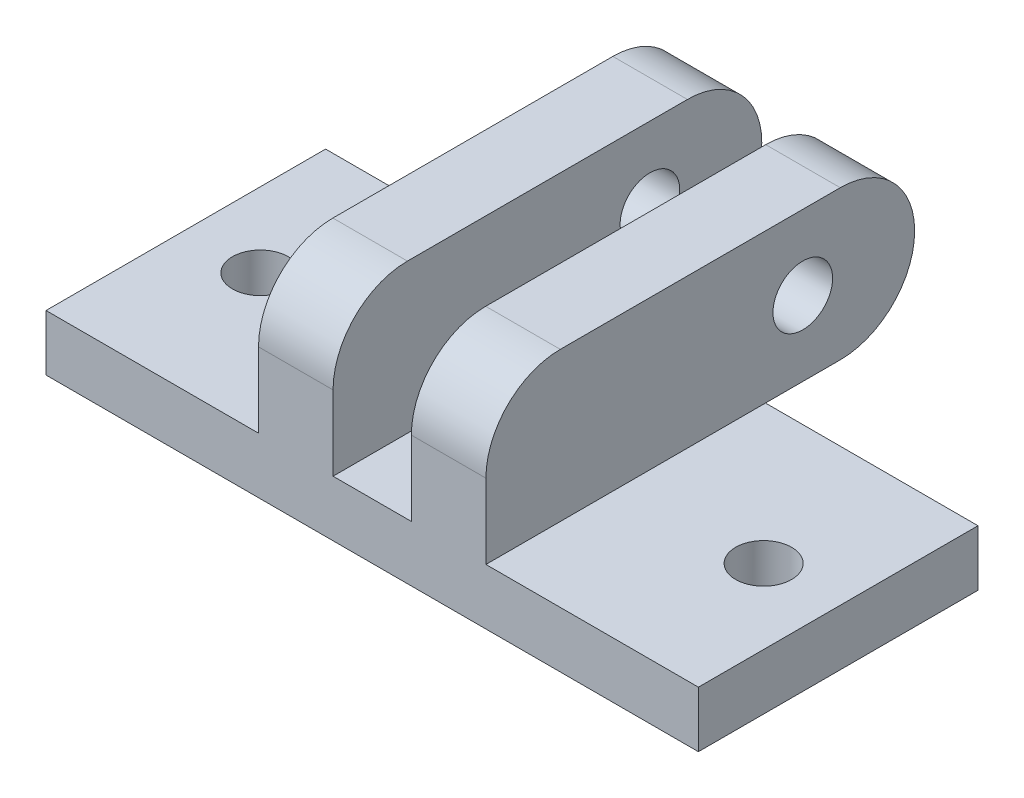
ISO-10303-21;
HEADER;
FILE_DESCRIPTION(('STEP AP214'),'2;1');
FILE_NAME('part.step','',(''),(''),'','','');
FILE_SCHEMA(('AUTOMOTIVE_DESIGN { 1 0 10303 214 1 1 1 1 }'));
ENDSEC;
DATA;
#1=APPLICATION_CONTEXT('core data for automotive mechanical design processes');
#2=APPLICATION_PROTOCOL_DEFINITION('international standard','automotive_design',2000,#1);
#3=PRODUCT_CONTEXT('',#1,'mechanical');
#4=PRODUCT('Part','Part','',(#3));
#5=PRODUCT_RELATED_PRODUCT_CATEGORY('part','',(#4));
#6=PRODUCT_DEFINITION_FORMATION('','',#4);
#7=PRODUCT_DEFINITION_CONTEXT('part definition',#1,'design');
#8=PRODUCT_DEFINITION('design','',#6,#7);
#9=PRODUCT_DEFINITION_SHAPE('','',#8);
#10=(LENGTH_UNIT() NAMED_UNIT(*) SI_UNIT(.MILLI.,.METRE.));
#11=(NAMED_UNIT(*) PLANE_ANGLE_UNIT() SI_UNIT($,.RADIAN.));
#12=(NAMED_UNIT(*) SI_UNIT($,.STERADIAN.) SOLID_ANGLE_UNIT());
#13=UNCERTAINTY_MEASURE_WITH_UNIT(LENGTH_MEASURE(1.E-05),#10,'distance_accuracy_value','');
#14=(GEOMETRIC_REPRESENTATION_CONTEXT(3) GLOBAL_UNCERTAINTY_ASSIGNED_CONTEXT((#13)) GLOBAL_UNIT_ASSIGNED_CONTEXT((#10,
#11,#12)) REPRESENTATION_CONTEXT('',''));
#15=CARTESIAN_POINT('',(0.,0.,0.));
#16=DIRECTION('',(0.,0.,1.));
#17=DIRECTION('',(1.,0.,0.));
#18=AXIS2_PLACEMENT_3D('',#15,#16,#17);
#19=CARTESIAN_POINT('',(2.1,11.,-15.5));
#20=DIRECTION('',(0.,0.,1.));
#21=DIRECTION('',(1.,0.,0.));
#22=AXIS2_PLACEMENT_3D('',#19,#20,#21);
#23=PLANE('',#22);
#24=DIRECTION('',(1.,0.,0.));
#25=VECTOR('',#24,1.);
#26=CARTESIAN_POINT('',(-1.9,7.00999999999997,-15.5));
#27=LINE('',#26,#25);
#28=CARTESIAN_POINT('',(2.1,7.00999999999997,-15.5));
#29=VERTEX_POINT('',#28);
#30=CARTESIAN_POINT('',(6.1,7.00999999999997,-15.5));
#31=VERTEX_POINT('',#30);
#32=EDGE_CURVE('E199',#29,#31,#27,.T.);
#33=ORIENTED_EDGE('',*,*,#32,.T.);
#34=DIRECTION('',(0.,-1.,0.));
#35=VECTOR('',#34,1.);
#36=CARTESIAN_POINT('',(6.1,11.,-15.5));
#37=LINE('',#36,#35);
#38=CARTESIAN_POINT('',(6.1,6.99000000000003,-15.5));
#39=VERTEX_POINT('',#38);
#40=EDGE_CURVE('E197',#31,#39,#37,.T.);
#41=ORIENTED_EDGE('',*,*,#40,.T.);
#42=DIRECTION('',(1.,0.,0.));
#43=VECTOR('',#42,1.);
#44=CARTESIAN_POINT('',(-1.9,6.99,-15.5));
#45=LINE('',#44,#43);
#46=CARTESIAN_POINT('',(2.1,6.99,-15.5));
#47=VERTEX_POINT('',#46);
#48=EDGE_CURVE('E11',#39,#47,#45,.F.);
#49=ORIENTED_EDGE('',*,*,#48,.T.);
#50=DIRECTION('',(0.,-1.,0.));
#51=VECTOR('',#50,1.);
#52=CARTESIAN_POINT('',(2.1,11.,-15.5));
#53=LINE('',#52,#51);
#54=EDGE_CURVE('E204',#29,#47,#53,.T.);
#55=ORIENTED_EDGE('',*,*,#54,.F.);
#56=EDGE_LOOP('',(#33,#41,#49,#55));
#57=FACE_BOUND('',#56,.T.);
#58=ADVANCED_FACE('F39',(#57),#23,.F.);
#59=CARTESIAN_POINT('',(0.,11.,0.));
#60=DIRECTION('',(0.,-1.,0.));
#61=DIRECTION('',(0.,0.,-1.));
#62=AXIS2_PLACEMENT_3D('',#59,#60,#61);
#63=PLANE('',#62);
#64=DIRECTION('',(0.,0.,-1.));
#65=VECTOR('',#64,1.);
#66=CARTESIAN_POINT('',(6.1,11.,7.5));
#67=LINE('',#66,#65);
#68=CARTESIAN_POINT('',(6.1,11.,3.50999999999997));
#69=VERTEX_POINT('',#68);
#70=CARTESIAN_POINT('',(6.1,11.,-11.51));
#71=VERTEX_POINT('',#70);
#72=EDGE_CURVE('E194',#69,#71,#67,.T.);
#73=ORIENTED_EDGE('',*,*,#72,.T.);
#74=DIRECTION('',(1.,0.,0.));
#75=VECTOR('',#74,1.);
#76=CARTESIAN_POINT('',(-1.9,11.,-11.51));
#77=LINE('',#76,#75);
#78=CARTESIAN_POINT('',(2.1,11.,-11.51));
#79=VERTEX_POINT('',#78);
#80=EDGE_CURVE('E49',#71,#79,#77,.F.);
#81=ORIENTED_EDGE('',*,*,#80,.T.);
#82=DIRECTION('',(0.,0.,1.));
#83=VECTOR('',#82,1.);
#84=CARTESIAN_POINT('',(2.1,11.,7.5));
#85=LINE('',#84,#83);
#86=CARTESIAN_POINT('',(2.1,11.,3.50999999999997));
#87=VERTEX_POINT('',#86);
#88=EDGE_CURVE('E205',#79,#87,#85,.T.);
#89=ORIENTED_EDGE('',*,*,#88,.T.);
#90=DIRECTION('',(1.,0.,0.));
#91=VECTOR('',#90,1.);
#92=CARTESIAN_POINT('',(-1.9,11.,3.51));
#93=LINE('',#92,#91);
#94=EDGE_CURVE('E188',#69,#87,#93,.F.);
#95=ORIENTED_EDGE('',*,*,#94,.F.);
#96=EDGE_LOOP('',(#73,#81,#89,#95));
#97=FACE_BOUND('',#96,.T.);
#98=ADVANCED_FACE('F202',(#97),#63,.F.);
#99=CARTESIAN_POINT('',(-17.5,3.,7.5));
#100=DIRECTION('',(0.,0.,-1.));
#101=DIRECTION('',(-1.,0.,0.));
#102=AXIS2_PLACEMENT_3D('',#99,#100,#101);
#103=PLANE('',#102);
#104=DIRECTION('',(0.,-1.,0.));
#105=VECTOR('',#104,1.);
#106=CARTESIAN_POINT('',(6.1,11.,7.5));
#107=LINE('',#106,#105);
#108=CARTESIAN_POINT('',(6.1,7.00999999999997,7.5));
#109=VERTEX_POINT('',#108);
#110=CARTESIAN_POINT('',(6.1,3.,7.5));
#111=VERTEX_POINT('',#110);
#112=EDGE_CURVE('E225',#109,#111,#107,.T.);
#113=ORIENTED_EDGE('',*,*,#112,.F.);
#114=DIRECTION('',(1.,0.,0.));
#115=VECTOR('',#114,1.);
#116=CARTESIAN_POINT('',(-1.9,7.00999999999997,7.5));
#117=LINE('',#116,#115);
#118=CARTESIAN_POINT('',(2.1,7.00999999999997,7.5));
#119=VERTEX_POINT('',#118);
#120=EDGE_CURVE('E200',#119,#109,#117,.T.);
#121=ORIENTED_EDGE('',*,*,#120,.F.);
#122=DIRECTION('',(0.,-1.,0.));
#123=VECTOR('',#122,1.);
#124=CARTESIAN_POINT('',(2.1,11.,7.5));
#125=LINE('',#124,#123);
#126=CARTESIAN_POINT('',(2.1,3.,7.5));
#127=VERTEX_POINT('',#126);
#128=EDGE_CURVE('E228',#119,#127,#125,.T.);
#129=ORIENTED_EDGE('',*,*,#128,.T.);
#130=DIRECTION('',(1.,0.,0.));
#131=VECTOR('',#130,1.);
#132=CARTESIAN_POINT('',(-17.5,3.,7.5));
#133=LINE('',#132,#131);
#134=CARTESIAN_POINT('',(-2.1,3.,7.5));
#135=VERTEX_POINT('',#134);
#136=EDGE_CURVE('E287',#135,#127,#133,.T.);
#137=ORIENTED_EDGE('',*,*,#136,.F.);
#138=DIRECTION('',(0.,-1.,0.));
#139=VECTOR('',#138,1.);
#140=CARTESIAN_POINT('',(-2.1,11.,7.5));
#141=LINE('',#140,#139);
#142=CARTESIAN_POINT('',(-2.1,7.00999999999997,7.5));
#143=VERTEX_POINT('',#142);
#144=EDGE_CURVE('E244',#143,#135,#141,.T.);
#145=ORIENTED_EDGE('',*,*,#144,.F.);
#146=DIRECTION('',(-1.,0.,0.));
#147=VECTOR('',#146,1.);
#148=CARTESIAN_POINT('',(1.9,7.00999999999997,7.5));
#149=LINE('',#148,#147);
#150=CARTESIAN_POINT('',(-6.1,7.00999999999997,7.5));
#151=VERTEX_POINT('',#150);
#152=EDGE_CURVE('E377',#143,#151,#149,.T.);
#153=ORIENTED_EDGE('',*,*,#152,.T.);
#154=DIRECTION('',(0.,-1.,0.));
#155=VECTOR('',#154,1.);
#156=CARTESIAN_POINT('',(-6.1,11.,7.5));
#157=LINE('',#156,#155);
#158=CARTESIAN_POINT('',(-6.1,3.,7.5));
#159=VERTEX_POINT('',#158);
#160=EDGE_CURVE('E254',#151,#159,#157,.T.);
#161=ORIENTED_EDGE('',*,*,#160,.T.);
#162=CARTESIAN_POINT('',(-17.5,3.,7.5));
#163=VERTEX_POINT('',#162);
#164=EDGE_CURVE('E282',#163,#159,#133,.T.);
#165=ORIENTED_EDGE('',*,*,#164,.F.);
#166=DIRECTION('',(0.,-1.,0.));
#167=VECTOR('',#166,1.);
#168=CARTESIAN_POINT('',(-17.5,3.,7.5));
#169=LINE('',#168,#167);
#170=CARTESIAN_POINT('',(-17.5,0.,7.5));
#171=VERTEX_POINT('',#170);
#172=EDGE_CURVE('E302',#163,#171,#169,.T.);
#173=ORIENTED_EDGE('',*,*,#172,.T.);
#174=DIRECTION('',(1.,0.,0.));
#175=VECTOR('',#174,1.);
#176=CARTESIAN_POINT('',(-17.5,0.,7.5));
#177=LINE('',#176,#175);
#178=CARTESIAN_POINT('',(17.5,0.,7.5));
#179=VERTEX_POINT('',#178);
#180=EDGE_CURVE('E271',#171,#179,#177,.T.);
#181=ORIENTED_EDGE('',*,*,#180,.T.);
#182=DIRECTION('',(0.,-1.,0.));
#183=VECTOR('',#182,1.);
#184=CARTESIAN_POINT('',(17.5,3.,7.5));
#185=LINE('',#184,#183);
#186=CARTESIAN_POINT('',(17.5,3.,7.5));
#187=VERTEX_POINT('',#186);
#188=EDGE_CURVE('E286',#187,#179,#185,.T.);
#189=ORIENTED_EDGE('',*,*,#188,.F.);
#190=EDGE_CURVE('E281',#111,#187,#133,.T.);
#191=ORIENTED_EDGE('',*,*,#190,.F.);
#192=EDGE_LOOP('',(#113,#121,#129,#137,#145,#153,#161,#165,#173,#181,#189,#191));
#193=FACE_BOUND('',#192,.T.);
#194=ADVANCED_FACE('F459',(#193),#103,.F.);
#195=CARTESIAN_POINT('',(-2.1,11.,7.5));
#196=DIRECTION('',(-1.,0.,0.));
#197=DIRECTION('',(0.,0.,1.));
#198=AXIS2_PLACEMENT_3D('',#195,#196,#197);
#199=PLANE('',#198);
#200=CARTESIAN_POINT('',(-2.1,7.,-9.5));
#201=DIRECTION('',(-1.,0.,0.));
#202=DIRECTION('',(0.,0.,1.));
#203=AXIS2_PLACEMENT_3D('',#200,#201,#202);
#204=CIRCLE('',#203,1.6);
#205=CARTESIAN_POINT('',(-2.1,7.,-7.9));
#206=VERTEX_POINT('',#205);
#207=EDGE_CURVE('E407',#206,#206,#204,.T.);
#208=ORIENTED_EDGE('',*,*,#207,.T.);
#209=EDGE_LOOP('',(#208));
#210=FACE_BOUND('',#209,.T.);
#211=DIRECTION('',(0.,0.,-1.));
#212=VECTOR('',#211,1.);
#213=CARTESIAN_POINT('',(-2.1,11.,7.5));
#214=LINE('',#213,#212);
#215=CARTESIAN_POINT('',(-2.1,11.,3.51));
#216=VERTEX_POINT('',#215);
#217=CARTESIAN_POINT('',(-2.1,11.,-11.51));
#218=VERTEX_POINT('',#217);
#219=EDGE_CURVE('E235',#216,#218,#214,.T.);
#220=ORIENTED_EDGE('',*,*,#219,.F.);
#221=CARTESIAN_POINT('',(-2.1,7.01,3.51));
#222=DIRECTION('',(-1.,0.,0.));
#223=DIRECTION('',(0.,0.,1.));
#224=AXIS2_PLACEMENT_3D('',#221,#222,#223);
#225=CIRCLE('',#224,3.99);
#226=EDGE_CURVE('E400',#216,#143,#225,.F.);
#227=ORIENTED_EDGE('',*,*,#226,.T.);
#228=ORIENTED_EDGE('',*,*,#144,.T.);
#229=DIRECTION('',(0.,0.,-1.));
#230=VECTOR('',#229,1.);
#231=CARTESIAN_POINT('',(-2.1,3.,7.5));
#232=LINE('',#231,#230);
#233=CARTESIAN_POINT('',(-2.1,3.,-7.5));
#234=VERTEX_POINT('',#233);
#235=EDGE_CURVE('E245',#135,#234,#232,.T.);
#236=ORIENTED_EDGE('',*,*,#235,.T.);
#237=CARTESIAN_POINT('',(-2.1,3.,-11.51));
#238=VERTEX_POINT('',#237);
#239=EDGE_CURVE('E234',#234,#238,#232,.T.);
#240=ORIENTED_EDGE('',*,*,#239,.T.);
#241=CARTESIAN_POINT('',(-2.1,6.99,-11.51));
#242=DIRECTION('',(-1.,0.,0.));
#243=DIRECTION('',(0.,0.,1.));
#244=AXIS2_PLACEMENT_3D('',#241,#242,#243);
#245=CIRCLE('',#244,3.99);
#246=CARTESIAN_POINT('',(-2.1,6.99000000000003,-15.5));
#247=VERTEX_POINT('',#246);
#248=EDGE_CURVE('E404',#238,#247,#245,.F.);
#249=ORIENTED_EDGE('',*,*,#248,.T.);
#250=DIRECTION('',(0.,-1.,0.));
#251=VECTOR('',#250,1.);
#252=CARTESIAN_POINT('',(-2.1,11.,-15.5));
#253=LINE('',#252,#251);
#254=CARTESIAN_POINT('',(-2.1,7.00999999999997,-15.5));
#255=VERTEX_POINT('',#254);
#256=EDGE_CURVE('E261',#255,#247,#253,.T.);
#257=ORIENTED_EDGE('',*,*,#256,.F.);
#258=CARTESIAN_POINT('',(-2.1,7.01,-11.51));
#259=DIRECTION('',(-1.,0.,0.));
#260=DIRECTION('',(0.,0.,1.));
#261=AXIS2_PLACEMENT_3D('',#258,#259,#260);
#262=CIRCLE('',#261,3.99);
#263=EDGE_CURVE('E394',#255,#218,#262,.F.);
#264=ORIENTED_EDGE('',*,*,#263,.T.);
#265=EDGE_LOOP('',(#220,#227,#228,#236,#240,#249,#257,#264));
#266=FACE_BOUND('',#265,.T.);
#267=ADVANCED_FACE('F479',(#210,#266),#199,.F.);
#268=CARTESIAN_POINT('',(-2.1,11.,-15.5));
#269=DIRECTION('',(0.,0.,1.));
#270=DIRECTION('',(1.,0.,0.));
#271=AXIS2_PLACEMENT_3D('',#268,#269,#270);
#272=PLANE('',#271);
#273=DIRECTION('',(0.,-1.,0.));
#274=VECTOR('',#273,1.);
#275=CARTESIAN_POINT('',(-6.1,11.,-15.5));
#276=LINE('',#275,#274);
#277=CARTESIAN_POINT('',(-6.1,7.00999999999997,-15.5));
#278=VERTEX_POINT('',#277);
#279=CARTESIAN_POINT('',(-6.1,6.99000000000003,-15.5));
#280=VERTEX_POINT('',#279);
#281=EDGE_CURVE('E257',#278,#280,#276,.T.);
#282=ORIENTED_EDGE('',*,*,#281,.F.);
#283=DIRECTION('',(-1.,0.,0.));
#284=VECTOR('',#283,1.);
#285=CARTESIAN_POINT('',(1.9,7.00999999999997,-15.5));
#286=LINE('',#285,#284);
#287=EDGE_CURVE('E378',#255,#278,#286,.T.);
#288=ORIENTED_EDGE('',*,*,#287,.F.);
#289=ORIENTED_EDGE('',*,*,#256,.T.);
#290=DIRECTION('',(-1.,0.,0.));
#291=VECTOR('',#290,1.);
#292=CARTESIAN_POINT('',(1.9,6.99000000000003,-15.5));
#293=LINE('',#292,#291);
#294=EDGE_CURVE('E390',#247,#280,#293,.T.);
#295=ORIENTED_EDGE('',*,*,#294,.T.);
#296=EDGE_LOOP('',(#282,#288,#289,#295));
#297=FACE_BOUND('',#296,.T.);
#298=ADVANCED_FACE('F491',(#297),#272,.F.);
#299=CARTESIAN_POINT('',(-6.1,11.,7.5));
#300=DIRECTION('',(1.,0.,0.));
#301=DIRECTION('',(0.,0.,-1.));
#302=AXIS2_PLACEMENT_3D('',#299,#300,#301);
#303=PLANE('',#302);
#304=CARTESIAN_POINT('',(-6.1,7.,-9.5));
#305=DIRECTION('',(-1.,0.,0.));
#306=DIRECTION('',(0.,0.,1.));
#307=AXIS2_PLACEMENT_3D('',#304,#305,#306);
#308=CIRCLE('',#307,1.6);
#309=CARTESIAN_POINT('',(-6.1,7.,-7.9));
#310=VERTEX_POINT('',#309);
#311=EDGE_CURVE('E369',#310,#310,#308,.T.);
#312=ORIENTED_EDGE('',*,*,#311,.F.);
#313=EDGE_LOOP('',(#312));
#314=FACE_BOUND('',#313,.T.);
#315=ORIENTED_EDGE('',*,*,#160,.F.);
#316=CARTESIAN_POINT('',(-6.1,7.01,3.51));
#317=DIRECTION('',(1.,0.,0.));
#318=DIRECTION('',(0.,0.,1.));
#319=AXIS2_PLACEMENT_3D('',#316,#317,#318);
#320=CIRCLE('',#319,3.99);
#321=CARTESIAN_POINT('',(-6.1,11.,3.50999999999997));
#322=VERTEX_POINT('',#321);
#323=EDGE_CURVE('E374',#322,#151,#320,.T.);
#324=ORIENTED_EDGE('',*,*,#323,.F.);
#325=DIRECTION('',(0.,0.,1.));
#326=VECTOR('',#325,1.);
#327=CARTESIAN_POINT('',(-6.1,11.,7.5));
#328=LINE('',#327,#326);
#329=CARTESIAN_POINT('',(-6.1,11.,-11.51));
#330=VERTEX_POINT('',#329);
#331=EDGE_CURVE('E239',#330,#322,#328,.T.);
#332=ORIENTED_EDGE('',*,*,#331,.F.);
#333=CARTESIAN_POINT('',(-6.1,7.01,-11.51));
#334=DIRECTION('',(1.,0.,0.));
#335=DIRECTION('',(0.,0.,1.));
#336=AXIS2_PLACEMENT_3D('',#333,#334,#335);
#337=CIRCLE('',#336,3.99);
#338=EDGE_CURVE('E373',#278,#330,#337,.T.);
#339=ORIENTED_EDGE('',*,*,#338,.F.);
#340=ORIENTED_EDGE('',*,*,#281,.T.);
#341=CARTESIAN_POINT('',(-6.1,6.99,-11.51));
#342=DIRECTION('',(1.,0.,0.));
#343=DIRECTION('',(0.,0.,-1.));
#344=AXIS2_PLACEMENT_3D('',#341,#342,#343);
#345=CIRCLE('',#344,3.99);
#346=CARTESIAN_POINT('',(-6.1,3.,-11.51));
#347=VERTEX_POINT('',#346);
#348=EDGE_CURVE('E382',#347,#280,#345,.T.);
#349=ORIENTED_EDGE('',*,*,#348,.F.);
#350=DIRECTION('',(0.,0.,1.));
#351=VECTOR('',#350,1.);
#352=CARTESIAN_POINT('',(-6.1,3.,7.5));
#353=LINE('',#352,#351);
#354=CARTESIAN_POINT('',(-6.1,3.,-7.5));
#355=VERTEX_POINT('',#354);
#356=EDGE_CURVE('E240',#347,#355,#353,.T.);
#357=ORIENTED_EDGE('',*,*,#356,.T.);
#358=EDGE_CURVE('E251',#355,#159,#353,.T.);
#359=ORIENTED_EDGE('',*,*,#358,.T.);
#360=EDGE_LOOP('',(#315,#324,#332,#339,#340,#349,#357,#359));
#361=FACE_BOUND('',#360,.T.);
#362=ADVANCED_FACE('F466',(#314,#361),#303,.F.);
#363=CARTESIAN_POINT('',(0.,11.,0.));
#364=DIRECTION('',(0.,1.,0.));
#365=DIRECTION('',(0.,0.,1.));
#366=AXIS2_PLACEMENT_3D('',#363,#364,#365);
#367=PLANE('',#366);
#368=ORIENTED_EDGE('',*,*,#331,.T.);
#369=DIRECTION('',(-1.,0.,0.));
#370=VECTOR('',#369,1.);
#371=CARTESIAN_POINT('',(1.9,11.,3.51));
#372=LINE('',#371,#370);
#373=EDGE_CURVE('E317',#322,#216,#372,.F.);
#374=ORIENTED_EDGE('',*,*,#373,.T.);
#375=ORIENTED_EDGE('',*,*,#219,.T.);
#376=DIRECTION('',(-1.,0.,0.));
#377=VECTOR('',#376,1.);
#378=CARTESIAN_POINT('',(1.9,11.,-11.51));
#379=LINE('',#378,#377);
#380=EDGE_CURVE('E314',#330,#218,#379,.F.);
#381=ORIENTED_EDGE('',*,*,#380,.F.);
#382=EDGE_LOOP('',(#368,#374,#375,#381));
#383=FACE_BOUND('',#382,.T.);
#384=ADVANCED_FACE('F495',(#383),#367,.T.);
#385=CARTESIAN_POINT('',(0.,3.,0.));
#386=DIRECTION('',(0.,-1.,0.));
#387=DIRECTION('',(0.,0.,-1.));
#388=AXIS2_PLACEMENT_3D('',#385,#386,#387);
#389=PLANE('',#388);
#390=DIRECTION('',(0.,0.,1.));
#391=VECTOR('',#390,1.);
#392=CARTESIAN_POINT('',(2.1,3.,7.5));
#393=LINE('',#392,#391);
#394=CARTESIAN_POINT('',(2.1,3.,-7.5));
#395=VERTEX_POINT('',#394);
#396=EDGE_CURVE('E219',#395,#127,#393,.T.);
#397=ORIENTED_EDGE('',*,*,#396,.F.);
#398=DIRECTION('',(-1.,0.,0.));
#399=VECTOR('',#398,1.);
#400=CARTESIAN_POINT('',(-17.5,3.,-7.5));
#401=LINE('',#400,#399);
#402=EDGE_CURVE('E277',#395,#234,#401,.T.);
#403=ORIENTED_EDGE('',*,*,#402,.T.);
#404=ORIENTED_EDGE('',*,*,#235,.F.);
#405=ORIENTED_EDGE('',*,*,#136,.T.);
#406=EDGE_LOOP('',(#397,#403,#404,#405));
#407=FACE_BOUND('',#406,.T.);
#408=ADVANCED_FACE('F422',(#407),#389,.F.);
#409=CARTESIAN_POINT('',(13.5,3.,0.));
#410=DIRECTION('',(0.,1.,0.));
#411=DIRECTION('',(0.,0.,1.));
#412=AXIS2_PLACEMENT_3D('',#409,#410,#411);
#413=CIRCLE('',#412,1.5);
#414=CARTESIAN_POINT('',(13.5,3.,1.5));
#415=VERTEX_POINT('',#414);
#416=EDGE_CURVE('E325',#415,#415,#413,.T.);
#417=ORIENTED_EDGE('',*,*,#416,.F.);
#418=EDGE_LOOP('',(#417));
#419=FACE_BOUND('',#418,.T.);
#420=DIRECTION('',(0.,0.,-1.));
#421=VECTOR('',#420,1.);
#422=CARTESIAN_POINT('',(6.1,3.,7.5));
#423=LINE('',#422,#421);
#424=CARTESIAN_POINT('',(6.1,3.,-7.5));
#425=VERTEX_POINT('',#424);
#426=EDGE_CURVE('E211',#111,#425,#423,.T.);
#427=ORIENTED_EDGE('',*,*,#426,.F.);
#428=ORIENTED_EDGE('',*,*,#190,.T.);
#429=DIRECTION('',(0.,0.,-1.));
#430=VECTOR('',#429,1.);
#431=CARTESIAN_POINT('',(17.5,3.,7.5));
#432=LINE('',#431,#430);
#433=CARTESIAN_POINT('',(17.5,3.,-7.5));
#434=VERTEX_POINT('',#433);
#435=EDGE_CURVE('E266',#187,#434,#432,.T.);
#436=ORIENTED_EDGE('',*,*,#435,.T.);
#437=EDGE_CURVE('E272',#434,#425,#401,.T.);
#438=ORIENTED_EDGE('',*,*,#437,.T.);
#439=EDGE_LOOP('',(#427,#428,#436,#438));
#440=FACE_BOUND('',#439,.T.);
#441=ADVANCED_FACE('F442',(#419,#440),#389,.F.);
#442=CARTESIAN_POINT('',(-13.5,3.,0.));
#443=DIRECTION('',(0.,1.,0.));
#444=DIRECTION('',(0.,0.,1.));
#445=AXIS2_PLACEMENT_3D('',#442,#443,#444);
#446=CIRCLE('',#445,1.5);
#447=CARTESIAN_POINT('',(-13.5,3.,1.5));
#448=VERTEX_POINT('',#447);
#449=EDGE_CURVE('E333',#448,#448,#446,.T.);
#450=ORIENTED_EDGE('',*,*,#449,.F.);
#451=EDGE_LOOP('',(#450));
#452=FACE_BOUND('',#451,.T.);
#453=ORIENTED_EDGE('',*,*,#358,.F.);
#454=CARTESIAN_POINT('',(-17.5,3.,-7.5));
#455=VERTEX_POINT('',#454);
#456=EDGE_CURVE('E270',#355,#455,#401,.T.);
#457=ORIENTED_EDGE('',*,*,#456,.T.);
#458=DIRECTION('',(0.,0.,1.));
#459=VECTOR('',#458,1.);
#460=CARTESIAN_POINT('',(-17.5,3.,7.5));
#461=LINE('',#460,#459);
#462=EDGE_CURVE('E276',#455,#163,#461,.T.);
#463=ORIENTED_EDGE('',*,*,#462,.T.);
#464=ORIENTED_EDGE('',*,*,#164,.T.);
#465=EDGE_LOOP('',(#453,#457,#463,#464));
#466=FACE_BOUND('',#465,.T.);
#467=ADVANCED_FACE('F464',(#452,#466),#389,.F.);
#468=CARTESIAN_POINT('',(17.5,3.,7.5));
#469=DIRECTION('',(-1.,0.,0.));
#470=DIRECTION('',(0.,0.,1.));
#471=AXIS2_PLACEMENT_3D('',#468,#469,#470);
#472=PLANE('',#471);
#473=DIRECTION('',(0.,0.,-1.));
#474=VECTOR('',#473,1.);
#475=CARTESIAN_POINT('',(17.5,0.,7.5));
#476=LINE('',#475,#474);
#477=CARTESIAN_POINT('',(17.5,0.,-7.5));
#478=VERTEX_POINT('',#477);
#479=EDGE_CURVE('E265',#179,#478,#476,.T.);
#480=ORIENTED_EDGE('',*,*,#479,.T.);
#481=DIRECTION('',(0.,-1.,0.));
#482=VECTOR('',#481,1.);
#483=CARTESIAN_POINT('',(17.5,3.,-7.5));
#484=LINE('',#483,#482);
#485=EDGE_CURVE('E310',#434,#478,#484,.T.);
#486=ORIENTED_EDGE('',*,*,#485,.F.);
#487=ORIENTED_EDGE('',*,*,#435,.F.);
#488=ORIENTED_EDGE('',*,*,#188,.T.);
#489=EDGE_LOOP('',(#480,#486,#487,#488));
#490=FACE_BOUND('',#489,.T.);
#491=ADVANCED_FACE('F41',(#490),#472,.F.);
#492=CARTESIAN_POINT('',(-17.5,3.,-7.5));
#493=DIRECTION('',(0.,0.,1.));
#494=DIRECTION('',(1.,0.,0.));
#495=AXIS2_PLACEMENT_3D('',#492,#493,#494);
#496=PLANE('',#495);
#497=DIRECTION('',(-1.,0.,0.));
#498=VECTOR('',#497,1.);
#499=CARTESIAN_POINT('',(-17.5,0.,-7.5));
#500=LINE('',#499,#498);
#501=CARTESIAN_POINT('',(-17.5,0.,-7.5));
#502=VERTEX_POINT('',#501);
#503=EDGE_CURVE('E291',#478,#502,#500,.T.);
#504=ORIENTED_EDGE('',*,*,#503,.T.);
#505=DIRECTION('',(0.,-1.,0.));
#506=VECTOR('',#505,1.);
#507=CARTESIAN_POINT('',(-17.5,3.,-7.5));
#508=LINE('',#507,#506);
#509=EDGE_CURVE('E306',#455,#502,#508,.T.);
#510=ORIENTED_EDGE('',*,*,#509,.F.);
#511=ORIENTED_EDGE('',*,*,#456,.F.);
#512=EDGE_CURVE('E278',#234,#355,#401,.T.);
#513=ORIENTED_EDGE('',*,*,#512,.F.);
#514=ORIENTED_EDGE('',*,*,#402,.F.);
#515=DIRECTION('',(1.,0.,0.));
#516=VECTOR('',#515,1.);
#517=CARTESIAN_POINT('',(-17.5,3.,-7.5));
#518=LINE('',#517,#516);
#519=EDGE_CURVE('E231',#395,#425,#518,.T.);
#520=ORIENTED_EDGE('',*,*,#519,.T.);
#521=ORIENTED_EDGE('',*,*,#437,.F.);
#522=ORIENTED_EDGE('',*,*,#485,.T.);
#523=EDGE_LOOP('',(#504,#510,#511,#513,#514,#520,#521,#522));
#524=FACE_BOUND('',#523,.T.);
#525=ADVANCED_FACE('F428',(#524),#496,.F.);
#526=CARTESIAN_POINT('',(-17.5,3.,7.5));
#527=DIRECTION('',(1.,0.,0.));
#528=DIRECTION('',(0.,0.,-1.));
#529=AXIS2_PLACEMENT_3D('',#526,#527,#528);
#530=PLANE('',#529);
#531=DIRECTION('',(0.,0.,1.));
#532=VECTOR('',#531,1.);
#533=CARTESIAN_POINT('',(-17.5,0.,7.5));
#534=LINE('',#533,#532);
#535=EDGE_CURVE('E294',#502,#171,#534,.T.);
#536=ORIENTED_EDGE('',*,*,#535,.T.);
#537=ORIENTED_EDGE('',*,*,#172,.F.);
#538=ORIENTED_EDGE('',*,*,#462,.F.);
#539=ORIENTED_EDGE('',*,*,#509,.T.);
#540=EDGE_LOOP('',(#536,#537,#538,#539));
#541=FACE_BOUND('',#540,.T.);
#542=ADVANCED_FACE('F455',(#541),#530,.F.);
#543=CARTESIAN_POINT('',(0.,0.,0.));
#544=DIRECTION('',(0.,-1.,0.));
#545=DIRECTION('',(0.,0.,-1.));
#546=AXIS2_PLACEMENT_3D('',#543,#544,#545);
#547=PLANE('',#546);
#548=CARTESIAN_POINT('',(13.5,0.,0.));
#549=DIRECTION('',(0.,-1.,0.));
#550=DIRECTION('',(0.,0.,-1.));
#551=AXIS2_PLACEMENT_3D('',#548,#549,#550);
#552=CIRCLE('',#551,1.5);
#553=CARTESIAN_POINT('',(13.5,0.,-1.5));
#554=VERTEX_POINT('',#553);
#555=EDGE_CURVE('E43',#554,#554,#552,.T.);
#556=ORIENTED_EDGE('',*,*,#555,.F.);
#557=EDGE_LOOP('',(#556));
#558=FACE_BOUND('',#557,.T.);
#559=CARTESIAN_POINT('',(-13.5,0.,0.));
#560=DIRECTION('',(0.,-1.,0.));
#561=DIRECTION('',(0.,0.,-1.));
#562=AXIS2_PLACEMENT_3D('',#559,#560,#561);
#563=CIRCLE('',#562,1.5);
#564=CARTESIAN_POINT('',(-13.5,0.,-1.5));
#565=VERTEX_POINT('',#564);
#566=EDGE_CURVE('E322',#565,#565,#563,.T.);
#567=ORIENTED_EDGE('',*,*,#566,.F.);
#568=EDGE_LOOP('',(#567));
#569=FACE_BOUND('',#568,.T.);
#570=ORIENTED_EDGE('',*,*,#479,.F.);
#571=ORIENTED_EDGE('',*,*,#180,.F.);
#572=ORIENTED_EDGE('',*,*,#535,.F.);
#573=ORIENTED_EDGE('',*,*,#503,.F.);
#574=EDGE_LOOP('',(#570,#571,#572,#573));
#575=FACE_BOUND('',#574,.T.);
#576=ADVANCED_FACE('F451',(#558,#569,#575),#547,.T.);
#577=CARTESIAN_POINT('',(0.,3.,0.));
#578=DIRECTION('',(0.,1.,0.));
#579=DIRECTION('',(0.,0.,1.));
#580=AXIS2_PLACEMENT_3D('',#577,#578,#579);
#581=PLANE('',#580);
#582=ORIENTED_EDGE('',*,*,#356,.F.);
#583=DIRECTION('',(-1.,0.,0.));
#584=VECTOR('',#583,1.);
#585=CARTESIAN_POINT('',(1.9,3.,-11.51));
#586=LINE('',#585,#584);
#587=EDGE_CURVE('E389',#238,#347,#586,.T.);
#588=ORIENTED_EDGE('',*,*,#587,.F.);
#589=ORIENTED_EDGE('',*,*,#239,.F.);
#590=ORIENTED_EDGE('',*,*,#512,.T.);
#591=EDGE_LOOP('',(#582,#588,#589,#590));
#592=FACE_BOUND('',#591,.T.);
#593=ADVANCED_FACE('F483',(#592),#581,.F.);
#594=CARTESIAN_POINT('',(0.,3.,0.));
#595=DIRECTION('',(0.,-1.,0.));
#596=DIRECTION('',(0.,0.,-1.));
#597=AXIS2_PLACEMENT_3D('',#594,#595,#596);
#598=PLANE('',#597);
#599=DIRECTION('',(1.,0.,0.));
#600=VECTOR('',#599,1.);
#601=CARTESIAN_POINT('',(-1.9,3.,-11.51));
#602=LINE('',#601,#600);
#603=CARTESIAN_POINT('',(2.1,3.,-11.51));
#604=VERTEX_POINT('',#603);
#605=CARTESIAN_POINT('',(6.1,3.,-11.51));
#606=VERTEX_POINT('',#605);
#607=EDGE_CURVE('E353',#604,#606,#602,.T.);
#608=ORIENTED_EDGE('',*,*,#607,.T.);
#609=EDGE_CURVE('E218',#425,#606,#423,.T.);
#610=ORIENTED_EDGE('',*,*,#609,.F.);
#611=ORIENTED_EDGE('',*,*,#519,.F.);
#612=EDGE_CURVE('E215',#604,#395,#393,.T.);
#613=ORIENTED_EDGE('',*,*,#612,.F.);
#614=EDGE_LOOP('',(#608,#610,#611,#613));
#615=FACE_BOUND('',#614,.T.);
#616=ADVANCED_FACE('F435',(#615),#598,.T.);
#617=CARTESIAN_POINT('',(2.1,11.,7.5));
#618=DIRECTION('',(1.,0.,0.));
#619=DIRECTION('',(0.,0.,-1.));
#620=AXIS2_PLACEMENT_3D('',#617,#618,#619);
#621=PLANE('',#620);
#622=CARTESIAN_POINT('',(2.1,7.,-9.5));
#623=DIRECTION('',(1.,0.,0.));
#624=DIRECTION('',(0.,0.,-1.));
#625=AXIS2_PLACEMENT_3D('',#622,#623,#624);
#626=CIRCLE('',#625,1.6);
#627=CARTESIAN_POINT('',(2.1,7.,-11.1));
#628=VERTEX_POINT('',#627);
#629=EDGE_CURVE('E365',#628,#628,#626,.T.);
#630=ORIENTED_EDGE('',*,*,#629,.T.);
#631=EDGE_LOOP('',(#630));
#632=FACE_BOUND('',#631,.T.);
#633=ORIENTED_EDGE('',*,*,#88,.F.);
#634=CARTESIAN_POINT('',(2.1,7.01,-11.51));
#635=DIRECTION('',(1.,0.,0.));
#636=DIRECTION('',(0.,0.,-1.));
#637=AXIS2_PLACEMENT_3D('',#634,#635,#636);
#638=CIRCLE('',#637,3.99);
#639=EDGE_CURVE('E182',#79,#29,#638,.F.);
#640=ORIENTED_EDGE('',*,*,#639,.T.);
#641=ORIENTED_EDGE('',*,*,#54,.T.);
#642=CARTESIAN_POINT('',(2.1,6.99,-11.51));
#643=DIRECTION('',(1.,0.,0.));
#644=DIRECTION('',(0.,0.,-1.));
#645=AXIS2_PLACEMENT_3D('',#642,#643,#644);
#646=CIRCLE('',#645,3.99);
#647=EDGE_CURVE('E57',#47,#604,#646,.F.);
#648=ORIENTED_EDGE('',*,*,#647,.T.);
#649=ORIENTED_EDGE('',*,*,#612,.T.);
#650=ORIENTED_EDGE('',*,*,#396,.T.);
#651=ORIENTED_EDGE('',*,*,#128,.F.);
#652=CARTESIAN_POINT('',(2.1,7.01,3.51));
#653=DIRECTION('',(1.,0.,0.));
#654=DIRECTION('',(0.,0.,-1.));
#655=AXIS2_PLACEMENT_3D('',#652,#653,#654);
#656=CIRCLE('',#655,3.99);
#657=EDGE_CURVE('E357',#119,#87,#656,.F.);
#658=ORIENTED_EDGE('',*,*,#657,.T.);
#659=EDGE_LOOP('',(#633,#640,#641,#648,#649,#650,#651,#658));
#660=FACE_BOUND('',#659,.T.);
#661=ADVANCED_FACE('F417',(#632,#660),#621,.F.);
#662=CARTESIAN_POINT('',(6.1,11.,7.5));
#663=DIRECTION('',(-1.,0.,0.));
#664=DIRECTION('',(0.,0.,1.));
#665=AXIS2_PLACEMENT_3D('',#662,#663,#664);
#666=PLANE('',#665);
#667=CARTESIAN_POINT('',(6.1,7.,-9.5));
#668=DIRECTION('',(1.,0.,0.));
#669=DIRECTION('',(0.,0.,-1.));
#670=AXIS2_PLACEMENT_3D('',#667,#668,#669);
#671=CIRCLE('',#670,1.6);
#672=CARTESIAN_POINT('',(6.1,7.,-11.1));
#673=VERTEX_POINT('',#672);
#674=EDGE_CURVE('E331',#673,#673,#671,.T.);
#675=ORIENTED_EDGE('',*,*,#674,.F.);
#676=EDGE_LOOP('',(#675));
#677=FACE_BOUND('',#676,.T.);
#678=ORIENTED_EDGE('',*,*,#40,.F.);
#679=CARTESIAN_POINT('',(6.1,7.01,-11.51));
#680=DIRECTION('',(-1.,0.,0.));
#681=DIRECTION('',(0.,0.,1.));
#682=AXIS2_PLACEMENT_3D('',#679,#680,#681);
#683=CIRCLE('',#682,3.99);
#684=EDGE_CURVE('E179',#71,#31,#683,.T.);
#685=ORIENTED_EDGE('',*,*,#684,.F.);
#686=ORIENTED_EDGE('',*,*,#72,.F.);
#687=CARTESIAN_POINT('',(6.1,7.01,3.51));
#688=DIRECTION('',(-1.,0.,0.));
#689=DIRECTION('',(0.,0.,1.));
#690=AXIS2_PLACEMENT_3D('',#687,#688,#689);
#691=CIRCLE('',#690,3.99);
#692=EDGE_CURVE('E64',#109,#69,#691,.T.);
#693=ORIENTED_EDGE('',*,*,#692,.F.);
#694=ORIENTED_EDGE('',*,*,#112,.T.);
#695=ORIENTED_EDGE('',*,*,#426,.T.);
#696=ORIENTED_EDGE('',*,*,#609,.T.);
#697=CARTESIAN_POINT('',(6.1,6.99,-11.51));
#698=DIRECTION('',(-1.,0.,0.));
#699=DIRECTION('',(0.,0.,1.));
#700=AXIS2_PLACEMENT_3D('',#697,#698,#699);
#701=CIRCLE('',#700,3.99);
#702=EDGE_CURVE('E346',#39,#606,#701,.T.);
#703=ORIENTED_EDGE('',*,*,#702,.F.);
#704=EDGE_LOOP('',(#678,#685,#686,#693,#694,#695,#696,#703));
#705=FACE_BOUND('',#704,.T.);
#706=ADVANCED_FACE('F193',(#677,#705),#666,.F.);
#707=CARTESIAN_POINT('',(1.9,7.01,-11.51));
#708=DIRECTION('',(-1.,0.,0.));
#709=DIRECTION('',(0.,0.,1.));
#710=AXIS2_PLACEMENT_3D('',#707,#708,#709);
#711=CYLINDRICAL_SURFACE('',#710,3.99);
#712=ORIENTED_EDGE('',*,*,#287,.T.);
#713=ORIENTED_EDGE('',*,*,#338,.T.);
#714=ORIENTED_EDGE('',*,*,#380,.T.);
#715=ORIENTED_EDGE('',*,*,#263,.F.);
#716=EDGE_LOOP('',(#712,#713,#714,#715));
#717=FACE_BOUND('',#716,.T.);
#718=ADVANCED_FACE('F527',(#717),#711,.T.);
#719=CARTESIAN_POINT('',(1.9,7.01,3.51));
#720=DIRECTION('',(-1.,0.,0.));
#721=DIRECTION('',(0.,0.,1.));
#722=AXIS2_PLACEMENT_3D('',#719,#720,#721);
#723=CYLINDRICAL_SURFACE('',#722,3.99);
#724=ORIENTED_EDGE('',*,*,#373,.F.);
#725=ORIENTED_EDGE('',*,*,#323,.T.);
#726=ORIENTED_EDGE('',*,*,#152,.F.);
#727=ORIENTED_EDGE('',*,*,#226,.F.);
#728=EDGE_LOOP('',(#724,#725,#726,#727));
#729=FACE_BOUND('',#728,.T.);
#730=ADVANCED_FACE('F497',(#729),#723,.T.);
#731=CARTESIAN_POINT('',(1.9,6.99,-11.51));
#732=DIRECTION('',(-1.,0.,0.));
#733=DIRECTION('',(0.,0.,1.));
#734=AXIS2_PLACEMENT_3D('',#731,#732,#733);
#735=CYLINDRICAL_SURFACE('',#734,3.99);
#736=ORIENTED_EDGE('',*,*,#587,.T.);
#737=ORIENTED_EDGE('',*,*,#348,.T.);
#738=ORIENTED_EDGE('',*,*,#294,.F.);
#739=ORIENTED_EDGE('',*,*,#248,.F.);
#740=EDGE_LOOP('',(#736,#737,#738,#739));
#741=FACE_BOUND('',#740,.T.);
#742=ADVANCED_FACE('F485',(#741),#735,.T.);
#743=CARTESIAN_POINT('',(1.9,7.,-9.5));
#744=DIRECTION('',(-1.,0.,0.));
#745=DIRECTION('',(0.,0.,1.));
#746=AXIS2_PLACEMENT_3D('',#743,#744,#745);
#747=CYLINDRICAL_SURFACE('',#746,1.6);
#748=ORIENTED_EDGE('',*,*,#311,.T.);
#749=EDGE_LOOP('',(#748));
#750=FACE_BOUND('',#749,.T.);
#751=ORIENTED_EDGE('',*,*,#207,.F.);
#752=EDGE_LOOP('',(#751));
#753=FACE_BOUND('',#752,.T.);
#754=ADVANCED_FACE('F574',(#750,#753),#747,.F.);
#755=CARTESIAN_POINT('',(-1.9,7.01,3.51));
#756=DIRECTION('',(1.,0.,0.));
#757=DIRECTION('',(0.,0.,-1.));
#758=AXIS2_PLACEMENT_3D('',#755,#756,#757);
#759=CYLINDRICAL_SURFACE('',#758,3.99);
#760=ORIENTED_EDGE('',*,*,#120,.T.);
#761=ORIENTED_EDGE('',*,*,#692,.T.);
#762=ORIENTED_EDGE('',*,*,#94,.T.);
#763=ORIENTED_EDGE('',*,*,#657,.F.);
#764=EDGE_LOOP('',(#760,#761,#762,#763));
#765=FACE_BOUND('',#764,.T.);
#766=ADVANCED_FACE('F500',(#765),#759,.T.);
#767=CARTESIAN_POINT('',(-1.9,7.01,-11.51));
#768=DIRECTION('',(1.,0.,0.));
#769=DIRECTION('',(0.,0.,-1.));
#770=AXIS2_PLACEMENT_3D('',#767,#768,#769);
#771=CYLINDRICAL_SURFACE('',#770,3.99);
#772=ORIENTED_EDGE('',*,*,#80,.F.);
#773=ORIENTED_EDGE('',*,*,#684,.T.);
#774=ORIENTED_EDGE('',*,*,#32,.F.);
#775=ORIENTED_EDGE('',*,*,#639,.F.);
#776=EDGE_LOOP('',(#772,#773,#774,#775));
#777=FACE_BOUND('',#776,.T.);
#778=ADVANCED_FACE('F178',(#777),#771,.T.);
#779=CARTESIAN_POINT('',(-1.9,6.99,-11.51));
#780=DIRECTION('',(1.,0.,0.));
#781=DIRECTION('',(0.,0.,-1.));
#782=AXIS2_PLACEMENT_3D('',#779,#780,#781);
#783=CYLINDRICAL_SURFACE('',#782,3.99);
#784=ORIENTED_EDGE('',*,*,#48,.F.);
#785=ORIENTED_EDGE('',*,*,#702,.T.);
#786=ORIENTED_EDGE('',*,*,#607,.F.);
#787=ORIENTED_EDGE('',*,*,#647,.F.);
#788=EDGE_LOOP('',(#784,#785,#786,#787));
#789=FACE_BOUND('',#788,.T.);
#790=ADVANCED_FACE('F503',(#789),#783,.T.);
#791=CARTESIAN_POINT('',(-1.9,7.,-9.5));
#792=DIRECTION('',(1.,0.,0.));
#793=DIRECTION('',(0.,0.,-1.));
#794=AXIS2_PLACEMENT_3D('',#791,#792,#793);
#795=CYLINDRICAL_SURFACE('',#794,1.6);
#796=ORIENTED_EDGE('',*,*,#674,.T.);
#797=EDGE_LOOP('',(#796));
#798=FACE_BOUND('',#797,.T.);
#799=ORIENTED_EDGE('',*,*,#629,.F.);
#800=EDGE_LOOP('',(#799));
#801=FACE_BOUND('',#800,.T.);
#802=ADVANCED_FACE('F505',(#798,#801),#795,.F.);
#803=CARTESIAN_POINT('',(-13.5,-5.,0.));
#804=DIRECTION('',(0.,1.,0.));
#805=DIRECTION('',(0.,0.,1.));
#806=AXIS2_PLACEMENT_3D('',#803,#804,#805);
#807=CYLINDRICAL_SURFACE('',#806,1.5);
#808=ORIENTED_EDGE('',*,*,#566,.T.);
#809=EDGE_LOOP('',(#808));
#810=FACE_BOUND('',#809,.T.);
#811=ORIENTED_EDGE('',*,*,#449,.T.);
#812=EDGE_LOOP('',(#811));
#813=FACE_BOUND('',#812,.T.);
#814=ADVANCED_FACE('F511',(#810,#813),#807,.F.);
#815=CARTESIAN_POINT('',(13.5,-5.,0.));
#816=DIRECTION('',(0.,1.,0.));
#817=DIRECTION('',(0.,0.,1.));
#818=AXIS2_PLACEMENT_3D('',#815,#816,#817);
#819=CYLINDRICAL_SURFACE('',#818,1.5);
#820=ORIENTED_EDGE('',*,*,#555,.T.);
#821=EDGE_LOOP('',(#820));
#822=FACE_BOUND('',#821,.T.);
#823=ORIENTED_EDGE('',*,*,#416,.T.);
#824=EDGE_LOOP('',(#823));
#825=FACE_BOUND('',#824,.T.);
#826=ADVANCED_FACE('F566',(#822,#825),#819,.F.);
#827=CLOSED_SHELL('',(#58,#98,#194,#267,#298,#362,#384,#408,#441,#467,#491,#525,#542,#576,#593,
#616,#661,#706,#718,#730,#742,#754,#766,#778,#790,#802,#814,#826));
#828=MANIFOLD_SOLID_BREP('B2',#827);
#829=ADVANCED_BREP_SHAPE_REPRESENTATION('',(#18,#828),#14);
#830=SHAPE_DEFINITION_REPRESENTATION(#9,#829);
ENDSEC;
END-ISO-10303-21;
